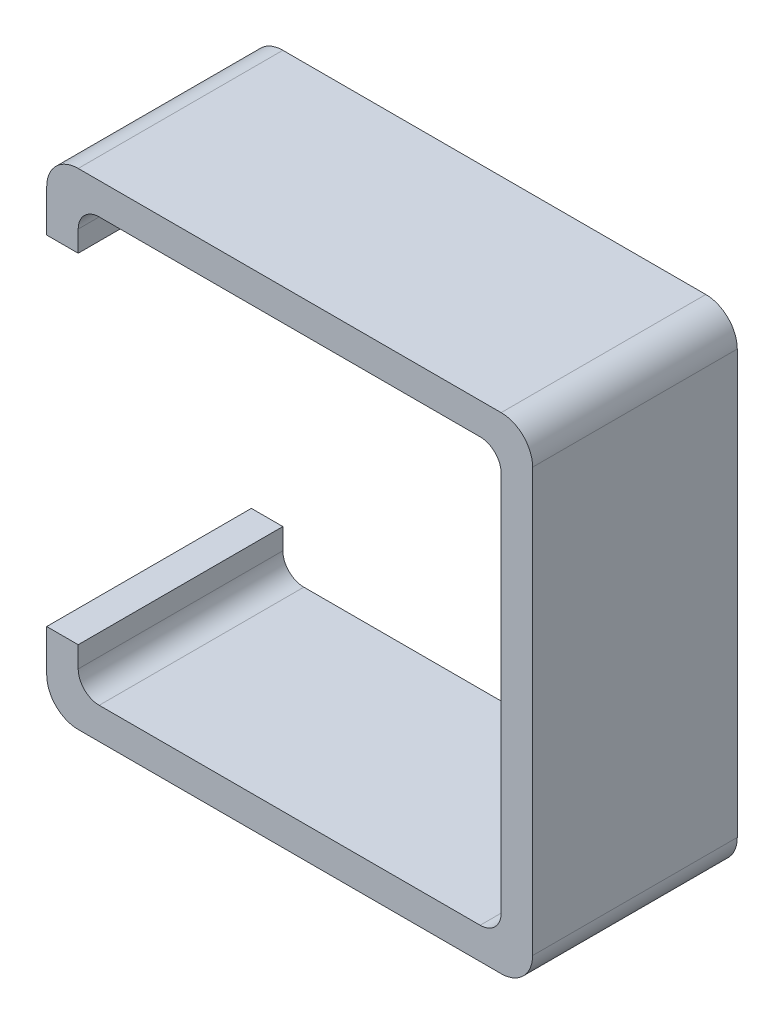
ISO-10303-21;
HEADER;
FILE_DESCRIPTION(('STEP AP214'),'2;1');
FILE_NAME('part.step','',(''),(''),'','','');
FILE_SCHEMA(('AUTOMOTIVE_DESIGN { 1 0 10303 214 1 1 1 1 }'));
ENDSEC;
DATA;
#1=APPLICATION_CONTEXT('core data for automotive mechanical design processes');
#2=APPLICATION_PROTOCOL_DEFINITION('international standard','automotive_design',2000,#1);
#3=PRODUCT_CONTEXT('',#1,'mechanical');
#4=PRODUCT('Part','Part','',(#3));
#5=PRODUCT_RELATED_PRODUCT_CATEGORY('part','',(#4));
#6=PRODUCT_DEFINITION_FORMATION('','',#4);
#7=PRODUCT_DEFINITION_CONTEXT('part definition',#1,'design');
#8=PRODUCT_DEFINITION('design','',#6,#7);
#9=PRODUCT_DEFINITION_SHAPE('','',#8);
#10=(LENGTH_UNIT() NAMED_UNIT(*) SI_UNIT(.MILLI.,.METRE.));
#11=(NAMED_UNIT(*) PLANE_ANGLE_UNIT() SI_UNIT($,.RADIAN.));
#12=(NAMED_UNIT(*) SI_UNIT($,.STERADIAN.) SOLID_ANGLE_UNIT());
#13=UNCERTAINTY_MEASURE_WITH_UNIT(LENGTH_MEASURE(1.E-05),#10,'distance_accuracy_value','');
#14=(GEOMETRIC_REPRESENTATION_CONTEXT(3) GLOBAL_UNCERTAINTY_ASSIGNED_CONTEXT((#13)) GLOBAL_UNIT_ASSIGNED_CONTEXT((#10,
#11,#12)) REPRESENTATION_CONTEXT('',''));
#15=CARTESIAN_POINT('',(0.,0.,0.));
#16=DIRECTION('',(0.,0.,1.));
#17=DIRECTION('',(1.,0.,0.));
#18=AXIS2_PLACEMENT_3D('',#15,#16,#17);
#19=CARTESIAN_POINT('',(-18.15,8.15,19.5));
#20=DIRECTION('',(0.,-1.,0.));
#21=DIRECTION('',(0.,0.,-1.));
#22=AXIS2_PLACEMENT_3D('',#19,#20,#21);
#23=PLANE('',#22);
#24=DIRECTION('',(-1.,0.,0.));
#25=VECTOR('',#24,1.);
#26=CARTESIAN_POINT('',(-18.15,8.15,0.));
#27=LINE('',#26,#25);
#28=CARTESIAN_POINT('',(20.15,8.15,0.));
#29=VERTEX_POINT('',#28);
#30=CARTESIAN_POINT('',(-20.15,8.15,0.));
#31=VERTEX_POINT('',#30);
#32=EDGE_CURVE('E127',#29,#31,#27,.T.);
#33=ORIENTED_EDGE('',*,*,#32,.T.);
#34=DIRECTION('',(0.,0.,-1.));
#35=VECTOR('',#34,1.);
#36=CARTESIAN_POINT('',(-20.15,8.15,19.5));
#37=LINE('',#36,#35);
#38=CARTESIAN_POINT('',(-20.15,8.15,19.5));
#39=VERTEX_POINT('',#38);
#40=EDGE_CURVE('E11',#39,#31,#37,.T.);
#41=ORIENTED_EDGE('',*,*,#40,.F.);
#42=DIRECTION('',(-1.,0.,0.));
#43=VECTOR('',#42,1.);
#44=CARTESIAN_POINT('',(20.15,8.15,19.5));
#45=LINE('',#44,#43);
#46=CARTESIAN_POINT('',(20.15,8.15,19.5));
#47=VERTEX_POINT('',#46);
#48=EDGE_CURVE('E133',#47,#39,#45,.T.);
#49=ORIENTED_EDGE('',*,*,#48,.F.);
#50=DIRECTION('',(0.,0.,-1.));
#51=VECTOR('',#50,1.);
#52=CARTESIAN_POINT('',(20.15,8.15,19.5));
#53=LINE('',#52,#51);
#54=EDGE_CURVE('E203',#47,#29,#53,.T.);
#55=ORIENTED_EDGE('',*,*,#54,.T.);
#56=EDGE_LOOP('',(#33,#41,#49,#55));
#57=FACE_BOUND('',#56,.T.);
#58=ADVANCED_FACE('F39',(#57),#23,.F.);
#59=CARTESIAN_POINT('',(-20.15,5.15,19.5));
#60=DIRECTION('',(0.,0.,-1.));
#61=DIRECTION('',(-1.,0.,0.));
#62=AXIS2_PLACEMENT_3D('',#59,#60,#61);
#63=CYLINDRICAL_SURFACE('',#62,3.);
#64=CARTESIAN_POINT('',(-20.15,5.15,0.));
#65=DIRECTION('',(0.,0.,1.));
#66=DIRECTION('',(1.,0.,0.));
#67=AXIS2_PLACEMENT_3D('',#64,#65,#66);
#68=CIRCLE('',#67,3.);
#69=CARTESIAN_POINT('',(-23.15,5.15,0.));
#70=VERTEX_POINT('',#69);
#71=EDGE_CURVE('E208',#31,#70,#68,.T.);
#72=ORIENTED_EDGE('',*,*,#71,.T.);
#73=DIRECTION('',(0.,0.,-1.));
#74=VECTOR('',#73,1.);
#75=CARTESIAN_POINT('',(-23.15,5.15,19.5));
#76=LINE('',#75,#74);
#77=CARTESIAN_POINT('',(-23.15,5.15,19.5));
#78=VERTEX_POINT('',#77);
#79=EDGE_CURVE('E47',#78,#70,#76,.T.);
#80=ORIENTED_EDGE('',*,*,#79,.F.);
#81=CARTESIAN_POINT('',(-20.15,5.15,19.5));
#82=DIRECTION('',(0.,0.,1.));
#83=DIRECTION('',(1.,0.,0.));
#84=AXIS2_PLACEMENT_3D('',#81,#82,#83);
#85=CIRCLE('',#84,3.);
#86=EDGE_CURVE('E352',#39,#78,#85,.T.);
#87=ORIENTED_EDGE('',*,*,#86,.F.);
#88=ORIENTED_EDGE('',*,*,#40,.T.);
#89=EDGE_LOOP('',(#72,#80,#87,#88));
#90=FACE_BOUND('',#89,.T.);
#91=ADVANCED_FACE('F355',(#90),#63,.T.);
#92=CARTESIAN_POINT('',(-23.15,5.15,19.5));
#93=DIRECTION('',(1.,0.,0.));
#94=DIRECTION('',(0.,0.,-1.));
#95=AXIS2_PLACEMENT_3D('',#92,#93,#94);
#96=PLANE('',#95);
#97=DIRECTION('',(0.,-1.,0.));
#98=VECTOR('',#97,1.);
#99=CARTESIAN_POINT('',(-23.15,5.15,0.));
#100=LINE('',#99,#98);
#101=CARTESIAN_POINT('',(-23.15,1.15,0.));
#102=VERTEX_POINT('',#101);
#103=EDGE_CURVE('E210',#70,#102,#100,.T.);
#104=ORIENTED_EDGE('',*,*,#103,.T.);
#105=DIRECTION('',(0.,0.,-1.));
#106=VECTOR('',#105,1.);
#107=CARTESIAN_POINT('',(-23.15,1.15,19.5));
#108=LINE('',#107,#106);
#109=CARTESIAN_POINT('',(-23.15,1.15,19.5));
#110=VERTEX_POINT('',#109);
#111=EDGE_CURVE('E287',#110,#102,#108,.T.);
#112=ORIENTED_EDGE('',*,*,#111,.F.);
#113=DIRECTION('',(0.,-1.,0.));
#114=VECTOR('',#113,1.);
#115=CARTESIAN_POINT('',(-23.15,5.15,19.5));
#116=LINE('',#115,#114);
#117=EDGE_CURVE('E296',#78,#110,#116,.T.);
#118=ORIENTED_EDGE('',*,*,#117,.F.);
#119=ORIENTED_EDGE('',*,*,#79,.T.);
#120=EDGE_LOOP('',(#104,#112,#118,#119));
#121=FACE_BOUND('',#120,.T.);
#122=ADVANCED_FACE('F294',(#121),#96,.F.);
#123=CARTESIAN_POINT('',(-23.15,1.15,19.5));
#124=DIRECTION('',(0.,1.,0.));
#125=DIRECTION('',(0.,0.,1.));
#126=AXIS2_PLACEMENT_3D('',#123,#124,#125);
#127=PLANE('',#126);
#128=DIRECTION('',(1.,0.,0.));
#129=VECTOR('',#128,1.);
#130=CARTESIAN_POINT('',(-23.15,1.15,0.));
#131=LINE('',#130,#129);
#132=CARTESIAN_POINT('',(-20.15,1.15,0.));
#133=VERTEX_POINT('',#132);
#134=EDGE_CURVE('E212',#102,#133,#131,.T.);
#135=ORIENTED_EDGE('',*,*,#134,.T.);
#136=DIRECTION('',(0.,0.,-1.));
#137=VECTOR('',#136,1.);
#138=CARTESIAN_POINT('',(-20.15,1.15,19.5));
#139=LINE('',#138,#137);
#140=CARTESIAN_POINT('',(-20.15,1.15,19.5));
#141=VERTEX_POINT('',#140);
#142=EDGE_CURVE('E284',#141,#133,#139,.T.);
#143=ORIENTED_EDGE('',*,*,#142,.F.);
#144=DIRECTION('',(1.,0.,0.));
#145=VECTOR('',#144,1.);
#146=CARTESIAN_POINT('',(-23.15,1.15,19.5));
#147=LINE('',#146,#145);
#148=EDGE_CURVE('E314',#110,#141,#147,.T.);
#149=ORIENTED_EDGE('',*,*,#148,.F.);
#150=ORIENTED_EDGE('',*,*,#111,.T.);
#151=EDGE_LOOP('',(#135,#143,#149,#150));
#152=FACE_BOUND('',#151,.T.);
#153=ADVANCED_FACE('F305',(#152),#127,.F.);
#154=CARTESIAN_POINT('',(-20.15,1.15,19.5));
#155=DIRECTION('',(-1.,0.,0.));
#156=DIRECTION('',(0.,0.,1.));
#157=AXIS2_PLACEMENT_3D('',#154,#155,#156);
#158=PLANE('',#157);
#159=DIRECTION('',(0.,1.,0.));
#160=VECTOR('',#159,1.);
#161=CARTESIAN_POINT('',(-20.15,1.15,0.));
#162=LINE('',#161,#160);
#163=CARTESIAN_POINT('',(-20.15,3.15,0.));
#164=VERTEX_POINT('',#163);
#165=EDGE_CURVE('E214',#133,#164,#162,.T.);
#166=ORIENTED_EDGE('',*,*,#165,.T.);
#167=DIRECTION('',(0.,0.,-1.));
#168=VECTOR('',#167,1.);
#169=CARTESIAN_POINT('',(-20.15,3.15,19.5));
#170=LINE('',#169,#168);
#171=CARTESIAN_POINT('',(-20.15,3.15,19.5));
#172=VERTEX_POINT('',#171);
#173=EDGE_CURVE('E281',#172,#164,#170,.T.);
#174=ORIENTED_EDGE('',*,*,#173,.F.);
#175=DIRECTION('',(0.,1.,0.));
#176=VECTOR('',#175,1.);
#177=CARTESIAN_POINT('',(-20.15,1.15,19.5));
#178=LINE('',#177,#176);
#179=EDGE_CURVE('E311',#141,#172,#178,.T.);
#180=ORIENTED_EDGE('',*,*,#179,.F.);
#181=ORIENTED_EDGE('',*,*,#142,.T.);
#182=EDGE_LOOP('',(#166,#174,#180,#181));
#183=FACE_BOUND('',#182,.T.);
#184=ADVANCED_FACE('F309',(#183),#158,.F.);
#185=CARTESIAN_POINT('',(-18.15,3.15,19.5));
#186=DIRECTION('',(0.,0.,-1.));
#187=DIRECTION('',(-1.,0.,0.));
#188=AXIS2_PLACEMENT_3D('',#185,#186,#187);
#189=CYLINDRICAL_SURFACE('',#188,2.);
#190=CARTESIAN_POINT('',(-18.15,3.15,0.));
#191=DIRECTION('',(0.,0.,-1.));
#192=DIRECTION('',(1.,0.,0.));
#193=AXIS2_PLACEMENT_3D('',#190,#191,#192);
#194=CIRCLE('',#193,2.);
#195=CARTESIAN_POINT('',(-18.15,5.15,0.));
#196=VERTEX_POINT('',#195);
#197=EDGE_CURVE('E216',#164,#196,#194,.T.);
#198=ORIENTED_EDGE('',*,*,#197,.T.);
#199=DIRECTION('',(0.,0.,-1.));
#200=VECTOR('',#199,1.);
#201=CARTESIAN_POINT('',(-18.15,5.15,19.5));
#202=LINE('',#201,#200);
#203=CARTESIAN_POINT('',(-18.15,5.15,19.5));
#204=VERTEX_POINT('',#203);
#205=EDGE_CURVE('E278',#204,#196,#202,.T.);
#206=ORIENTED_EDGE('',*,*,#205,.F.);
#207=CARTESIAN_POINT('',(-18.15,3.15,19.5));
#208=DIRECTION('',(0.,0.,-1.));
#209=DIRECTION('',(1.,0.,0.));
#210=AXIS2_PLACEMENT_3D('',#207,#208,#209);
#211=CIRCLE('',#210,2.);
#212=EDGE_CURVE('E313',#172,#204,#211,.T.);
#213=ORIENTED_EDGE('',*,*,#212,.F.);
#214=ORIENTED_EDGE('',*,*,#173,.T.);
#215=EDGE_LOOP('',(#198,#206,#213,#214));
#216=FACE_BOUND('',#215,.T.);
#217=ADVANCED_FACE('F367',(#216),#189,.F.);
#218=CARTESIAN_POINT('',(-18.15,5.15,19.5));
#219=DIRECTION('',(0.,1.,0.));
#220=DIRECTION('',(0.,0.,1.));
#221=AXIS2_PLACEMENT_3D('',#218,#219,#220);
#222=PLANE('',#221);
#223=DIRECTION('',(1.,0.,0.));
#224=VECTOR('',#223,1.);
#225=CARTESIAN_POINT('',(-18.15,5.15,0.));
#226=LINE('',#225,#224);
#227=CARTESIAN_POINT('',(18.15,5.15,0.));
#228=VERTEX_POINT('',#227);
#229=EDGE_CURVE('E218',#196,#228,#226,.T.);
#230=ORIENTED_EDGE('',*,*,#229,.T.);
#231=DIRECTION('',(0.,0.,-1.));
#232=VECTOR('',#231,1.);
#233=CARTESIAN_POINT('',(18.15,5.15,19.5));
#234=LINE('',#233,#232);
#235=CARTESIAN_POINT('',(18.15,5.15,19.5));
#236=VERTEX_POINT('',#235);
#237=EDGE_CURVE('E275',#236,#228,#234,.T.);
#238=ORIENTED_EDGE('',*,*,#237,.F.);
#239=DIRECTION('',(1.,0.,0.));
#240=VECTOR('',#239,1.);
#241=CARTESIAN_POINT('',(-18.15,5.15,19.5));
#242=LINE('',#241,#240);
#243=EDGE_CURVE('E316',#204,#236,#242,.T.);
#244=ORIENTED_EDGE('',*,*,#243,.F.);
#245=ORIENTED_EDGE('',*,*,#205,.T.);
#246=EDGE_LOOP('',(#230,#238,#244,#245));
#247=FACE_BOUND('',#246,.T.);
#248=ADVANCED_FACE('F370',(#247),#222,.F.);
#249=CARTESIAN_POINT('',(18.15,3.15,19.5));
#250=DIRECTION('',(0.,0.,-1.));
#251=DIRECTION('',(-1.,0.,0.));
#252=AXIS2_PLACEMENT_3D('',#249,#250,#251);
#253=CYLINDRICAL_SURFACE('',#252,2.);
#254=CARTESIAN_POINT('',(18.15,3.15,0.));
#255=DIRECTION('',(0.,0.,-1.));
#256=DIRECTION('',(1.,0.,0.));
#257=AXIS2_PLACEMENT_3D('',#254,#255,#256);
#258=CIRCLE('',#257,2.);
#259=CARTESIAN_POINT('',(20.15,3.15,0.));
#260=VERTEX_POINT('',#259);
#261=EDGE_CURVE('E220',#228,#260,#258,.T.);
#262=ORIENTED_EDGE('',*,*,#261,.T.);
#263=DIRECTION('',(0.,0.,-1.));
#264=VECTOR('',#263,1.);
#265=CARTESIAN_POINT('',(20.15,3.15,19.5));
#266=LINE('',#265,#264);
#267=CARTESIAN_POINT('',(20.15,3.15,19.5));
#268=VERTEX_POINT('',#267);
#269=EDGE_CURVE('E272',#268,#260,#266,.T.);
#270=ORIENTED_EDGE('',*,*,#269,.F.);
#271=CARTESIAN_POINT('',(18.15,3.15,19.5));
#272=DIRECTION('',(0.,0.,-1.));
#273=DIRECTION('',(1.,0.,0.));
#274=AXIS2_PLACEMENT_3D('',#271,#272,#273);
#275=CIRCLE('',#274,2.);
#276=EDGE_CURVE('E322',#236,#268,#275,.T.);
#277=ORIENTED_EDGE('',*,*,#276,.F.);
#278=ORIENTED_EDGE('',*,*,#237,.T.);
#279=EDGE_LOOP('',(#262,#270,#277,#278));
#280=FACE_BOUND('',#279,.T.);
#281=ADVANCED_FACE('F374',(#280),#253,.F.);
#282=CARTESIAN_POINT('',(20.15,3.15,19.5));
#283=DIRECTION('',(1.,0.,0.));
#284=DIRECTION('',(0.,0.,-1.));
#285=AXIS2_PLACEMENT_3D('',#282,#283,#284);
#286=PLANE('',#285);
#287=DIRECTION('',(0.,-1.,0.));
#288=VECTOR('',#287,1.);
#289=CARTESIAN_POINT('',(20.15,3.15,0.));
#290=LINE('',#289,#288);
#291=CARTESIAN_POINT('',(20.15,-33.15,0.));
#292=VERTEX_POINT('',#291);
#293=EDGE_CURVE('E222',#260,#292,#290,.T.);
#294=ORIENTED_EDGE('',*,*,#293,.T.);
#295=DIRECTION('',(0.,0.,-1.));
#296=VECTOR('',#295,1.);
#297=CARTESIAN_POINT('',(20.15,-33.15,19.5));
#298=LINE('',#297,#296);
#299=CARTESIAN_POINT('',(20.15,-33.15,19.5));
#300=VERTEX_POINT('',#299);
#301=EDGE_CURVE('E269',#300,#292,#298,.T.);
#302=ORIENTED_EDGE('',*,*,#301,.F.);
#303=DIRECTION('',(0.,-1.,0.));
#304=VECTOR('',#303,1.);
#305=CARTESIAN_POINT('',(20.15,3.15,19.5));
#306=LINE('',#305,#304);
#307=EDGE_CURVE('E324',#268,#300,#306,.T.);
#308=ORIENTED_EDGE('',*,*,#307,.F.);
#309=ORIENTED_EDGE('',*,*,#269,.T.);
#310=EDGE_LOOP('',(#294,#302,#308,#309));
#311=FACE_BOUND('',#310,.T.);
#312=ADVANCED_FACE('F378',(#311),#286,.F.);
#313=CARTESIAN_POINT('',(18.15,-33.15,19.5));
#314=DIRECTION('',(0.,0.,-1.));
#315=DIRECTION('',(-1.,0.,0.));
#316=AXIS2_PLACEMENT_3D('',#313,#314,#315);
#317=CYLINDRICAL_SURFACE('',#316,2.);
#318=CARTESIAN_POINT('',(18.15,-33.15,0.));
#319=DIRECTION('',(0.,0.,-1.));
#320=DIRECTION('',(1.,0.,0.));
#321=AXIS2_PLACEMENT_3D('',#318,#319,#320);
#322=CIRCLE('',#321,2.);
#323=CARTESIAN_POINT('',(18.15,-35.15,0.));
#324=VERTEX_POINT('',#323);
#325=EDGE_CURVE('E224',#292,#324,#322,.T.);
#326=ORIENTED_EDGE('',*,*,#325,.T.);
#327=DIRECTION('',(0.,0.,-1.));
#328=VECTOR('',#327,1.);
#329=CARTESIAN_POINT('',(18.15,-35.15,19.5));
#330=LINE('',#329,#328);
#331=CARTESIAN_POINT('',(18.15,-35.15,19.5));
#332=VERTEX_POINT('',#331);
#333=EDGE_CURVE('E266',#332,#324,#330,.T.);
#334=ORIENTED_EDGE('',*,*,#333,.F.);
#335=CARTESIAN_POINT('',(18.15,-33.15,19.5));
#336=DIRECTION('',(0.,0.,-1.));
#337=DIRECTION('',(1.,0.,0.));
#338=AXIS2_PLACEMENT_3D('',#335,#336,#337);
#339=CIRCLE('',#338,2.);
#340=EDGE_CURVE('E326',#300,#332,#339,.T.);
#341=ORIENTED_EDGE('',*,*,#340,.F.);
#342=ORIENTED_EDGE('',*,*,#301,.T.);
#343=EDGE_LOOP('',(#326,#334,#341,#342));
#344=FACE_BOUND('',#343,.T.);
#345=ADVANCED_FACE('F382',(#344),#317,.F.);
#346=CARTESIAN_POINT('',(18.15,-35.15,19.5));
#347=DIRECTION('',(0.,-1.,0.));
#348=DIRECTION('',(0.,0.,-1.));
#349=AXIS2_PLACEMENT_3D('',#346,#347,#348);
#350=PLANE('',#349);
#351=DIRECTION('',(-1.,0.,0.));
#352=VECTOR('',#351,1.);
#353=CARTESIAN_POINT('',(18.15,-35.15,0.));
#354=LINE('',#353,#352);
#355=CARTESIAN_POINT('',(-18.15,-35.15,0.));
#356=VERTEX_POINT('',#355);
#357=EDGE_CURVE('E226',#324,#356,#354,.T.);
#358=ORIENTED_EDGE('',*,*,#357,.T.);
#359=DIRECTION('',(0.,0.,-1.));
#360=VECTOR('',#359,1.);
#361=CARTESIAN_POINT('',(-18.15,-35.15,19.5));
#362=LINE('',#361,#360);
#363=CARTESIAN_POINT('',(-18.15,-35.15,19.5));
#364=VERTEX_POINT('',#363);
#365=EDGE_CURVE('E263',#364,#356,#362,.T.);
#366=ORIENTED_EDGE('',*,*,#365,.F.);
#367=DIRECTION('',(-1.,0.,0.));
#368=VECTOR('',#367,1.);
#369=CARTESIAN_POINT('',(18.15,-35.15,19.5));
#370=LINE('',#369,#368);
#371=EDGE_CURVE('E328',#332,#364,#370,.T.);
#372=ORIENTED_EDGE('',*,*,#371,.F.);
#373=ORIENTED_EDGE('',*,*,#333,.T.);
#374=EDGE_LOOP('',(#358,#366,#372,#373));
#375=FACE_BOUND('',#374,.T.);
#376=ADVANCED_FACE('F386',(#375),#350,.F.);
#377=CARTESIAN_POINT('',(-18.15,-33.15,19.5));
#378=DIRECTION('',(0.,0.,-1.));
#379=DIRECTION('',(-1.,0.,0.));
#380=AXIS2_PLACEMENT_3D('',#377,#378,#379);
#381=CYLINDRICAL_SURFACE('',#380,2.);
#382=CARTESIAN_POINT('',(-18.15,-33.15,0.));
#383=DIRECTION('',(0.,0.,-1.));
#384=DIRECTION('',(1.,0.,0.));
#385=AXIS2_PLACEMENT_3D('',#382,#383,#384);
#386=CIRCLE('',#385,2.);
#387=CARTESIAN_POINT('',(-20.15,-33.15,0.));
#388=VERTEX_POINT('',#387);
#389=EDGE_CURVE('E228',#356,#388,#386,.T.);
#390=ORIENTED_EDGE('',*,*,#389,.T.);
#391=DIRECTION('',(0.,0.,-1.));
#392=VECTOR('',#391,1.);
#393=CARTESIAN_POINT('',(-20.15,-33.15,19.5));
#394=LINE('',#393,#392);
#395=CARTESIAN_POINT('',(-20.15,-33.15,19.5));
#396=VERTEX_POINT('',#395);
#397=EDGE_CURVE('E260',#396,#388,#394,.T.);
#398=ORIENTED_EDGE('',*,*,#397,.F.);
#399=CARTESIAN_POINT('',(-18.15,-33.15,19.5));
#400=DIRECTION('',(0.,0.,-1.));
#401=DIRECTION('',(1.,0.,0.));
#402=AXIS2_PLACEMENT_3D('',#399,#400,#401);
#403=CIRCLE('',#402,2.);
#404=EDGE_CURVE('E330',#364,#396,#403,.T.);
#405=ORIENTED_EDGE('',*,*,#404,.F.);
#406=ORIENTED_EDGE('',*,*,#365,.T.);
#407=EDGE_LOOP('',(#390,#398,#405,#406));
#408=FACE_BOUND('',#407,.T.);
#409=ADVANCED_FACE('F390',(#408),#381,.F.);
#410=CARTESIAN_POINT('',(-20.15,-33.15,19.5));
#411=DIRECTION('',(-1.,0.,0.));
#412=DIRECTION('',(0.,0.,1.));
#413=AXIS2_PLACEMENT_3D('',#410,#411,#412);
#414=PLANE('',#413);
#415=DIRECTION('',(0.,1.,0.));
#416=VECTOR('',#415,1.);
#417=CARTESIAN_POINT('',(-20.15,-33.15,0.));
#418=LINE('',#417,#416);
#419=CARTESIAN_POINT('',(-20.15,-31.15,0.));
#420=VERTEX_POINT('',#419);
#421=EDGE_CURVE('E230',#388,#420,#418,.T.);
#422=ORIENTED_EDGE('',*,*,#421,.T.);
#423=DIRECTION('',(0.,0.,-1.));
#424=VECTOR('',#423,1.);
#425=CARTESIAN_POINT('',(-20.15,-31.15,19.5));
#426=LINE('',#425,#424);
#427=CARTESIAN_POINT('',(-20.15,-31.15,19.5));
#428=VERTEX_POINT('',#427);
#429=EDGE_CURVE('E257',#428,#420,#426,.T.);
#430=ORIENTED_EDGE('',*,*,#429,.F.);
#431=DIRECTION('',(0.,1.,0.));
#432=VECTOR('',#431,1.);
#433=CARTESIAN_POINT('',(-20.15,-33.15,19.5));
#434=LINE('',#433,#432);
#435=EDGE_CURVE('E332',#396,#428,#434,.T.);
#436=ORIENTED_EDGE('',*,*,#435,.F.);
#437=ORIENTED_EDGE('',*,*,#397,.T.);
#438=EDGE_LOOP('',(#422,#430,#436,#437));
#439=FACE_BOUND('',#438,.T.);
#440=ADVANCED_FACE('F394',(#439),#414,.F.);
#441=CARTESIAN_POINT('',(-20.15,-31.15,19.5));
#442=DIRECTION('',(0.,-1.,0.));
#443=DIRECTION('',(0.,0.,-1.));
#444=AXIS2_PLACEMENT_3D('',#441,#442,#443);
#445=PLANE('',#444);
#446=DIRECTION('',(-1.,0.,0.));
#447=VECTOR('',#446,1.);
#448=CARTESIAN_POINT('',(-20.15,-31.15,0.));
#449=LINE('',#448,#447);
#450=CARTESIAN_POINT('',(-23.15,-31.15,0.));
#451=VERTEX_POINT('',#450);
#452=EDGE_CURVE('E232',#420,#451,#449,.T.);
#453=ORIENTED_EDGE('',*,*,#452,.T.);
#454=DIRECTION('',(0.,0.,-1.));
#455=VECTOR('',#454,1.);
#456=CARTESIAN_POINT('',(-23.15,-31.15,19.5));
#457=LINE('',#456,#455);
#458=CARTESIAN_POINT('',(-23.15,-31.15,19.5));
#459=VERTEX_POINT('',#458);
#460=EDGE_CURVE('E254',#459,#451,#457,.T.);
#461=ORIENTED_EDGE('',*,*,#460,.F.);
#462=DIRECTION('',(-1.,0.,0.));
#463=VECTOR('',#462,1.);
#464=CARTESIAN_POINT('',(-20.15,-31.15,19.5));
#465=LINE('',#464,#463);
#466=EDGE_CURVE('E334',#428,#459,#465,.T.);
#467=ORIENTED_EDGE('',*,*,#466,.F.);
#468=ORIENTED_EDGE('',*,*,#429,.T.);
#469=EDGE_LOOP('',(#453,#461,#467,#468));
#470=FACE_BOUND('',#469,.T.);
#471=ADVANCED_FACE('F398',(#470),#445,.F.);
#472=CARTESIAN_POINT('',(-23.15,-31.15,19.5));
#473=DIRECTION('',(1.,0.,0.));
#474=DIRECTION('',(0.,0.,-1.));
#475=AXIS2_PLACEMENT_3D('',#472,#473,#474);
#476=PLANE('',#475);
#477=DIRECTION('',(0.,-1.,0.));
#478=VECTOR('',#477,1.);
#479=CARTESIAN_POINT('',(-23.15,-31.15,0.));
#480=LINE('',#479,#478);
#481=CARTESIAN_POINT('',(-23.15,-35.15,0.));
#482=VERTEX_POINT('',#481);
#483=EDGE_CURVE('E234',#451,#482,#480,.T.);
#484=ORIENTED_EDGE('',*,*,#483,.T.);
#485=DIRECTION('',(0.,0.,-1.));
#486=VECTOR('',#485,1.);
#487=CARTESIAN_POINT('',(-23.15,-35.15,19.5));
#488=LINE('',#487,#486);
#489=CARTESIAN_POINT('',(-23.15,-35.15,19.5));
#490=VERTEX_POINT('',#489);
#491=EDGE_CURVE('E251',#490,#482,#488,.T.);
#492=ORIENTED_EDGE('',*,*,#491,.F.);
#493=DIRECTION('',(0.,-1.,0.));
#494=VECTOR('',#493,1.);
#495=CARTESIAN_POINT('',(-23.15,-31.15,19.5));
#496=LINE('',#495,#494);
#497=EDGE_CURVE('E336',#459,#490,#496,.T.);
#498=ORIENTED_EDGE('',*,*,#497,.F.);
#499=ORIENTED_EDGE('',*,*,#460,.T.);
#500=EDGE_LOOP('',(#484,#492,#498,#499));
#501=FACE_BOUND('',#500,.T.);
#502=ADVANCED_FACE('F402',(#501),#476,.F.);
#503=CARTESIAN_POINT('',(-20.15,-35.15,19.5));
#504=DIRECTION('',(0.,0.,-1.));
#505=DIRECTION('',(-1.,0.,0.));
#506=AXIS2_PLACEMENT_3D('',#503,#504,#505);
#507=CYLINDRICAL_SURFACE('',#506,3.);
#508=CARTESIAN_POINT('',(-20.15,-35.15,0.));
#509=DIRECTION('',(0.,0.,1.));
#510=DIRECTION('',(1.,0.,0.));
#511=AXIS2_PLACEMENT_3D('',#508,#509,#510);
#512=CIRCLE('',#511,3.);
#513=CARTESIAN_POINT('',(-20.15,-38.15,0.));
#514=VERTEX_POINT('',#513);
#515=EDGE_CURVE('E236',#482,#514,#512,.T.);
#516=ORIENTED_EDGE('',*,*,#515,.T.);
#517=DIRECTION('',(0.,0.,-1.));
#518=VECTOR('',#517,1.);
#519=CARTESIAN_POINT('',(-20.15,-38.15,19.5));
#520=LINE('',#519,#518);
#521=CARTESIAN_POINT('',(-20.15,-38.15,19.5));
#522=VERTEX_POINT('',#521);
#523=EDGE_CURVE('E248',#522,#514,#520,.T.);
#524=ORIENTED_EDGE('',*,*,#523,.F.);
#525=CARTESIAN_POINT('',(-20.15,-35.15,19.5));
#526=DIRECTION('',(0.,0.,1.));
#527=DIRECTION('',(1.,0.,0.));
#528=AXIS2_PLACEMENT_3D('',#525,#526,#527);
#529=CIRCLE('',#528,3.);
#530=EDGE_CURVE('E338',#490,#522,#529,.T.);
#531=ORIENTED_EDGE('',*,*,#530,.F.);
#532=ORIENTED_EDGE('',*,*,#491,.T.);
#533=EDGE_LOOP('',(#516,#524,#531,#532));
#534=FACE_BOUND('',#533,.T.);
#535=ADVANCED_FACE('F344',(#534),#507,.T.);
#536=CARTESIAN_POINT('',(-20.15,-38.15,19.5));
#537=DIRECTION('',(0.,1.,0.));
#538=DIRECTION('',(0.,0.,1.));
#539=AXIS2_PLACEMENT_3D('',#536,#537,#538);
#540=PLANE('',#539);
#541=DIRECTION('',(1.,0.,0.));
#542=VECTOR('',#541,1.);
#543=CARTESIAN_POINT('',(-20.15,-38.15,0.));
#544=LINE('',#543,#542);
#545=CARTESIAN_POINT('',(20.15,-38.15,0.));
#546=VERTEX_POINT('',#545);
#547=EDGE_CURVE('E238',#514,#546,#544,.T.);
#548=ORIENTED_EDGE('',*,*,#547,.T.);
#549=DIRECTION('',(0.,0.,-1.));
#550=VECTOR('',#549,1.);
#551=CARTESIAN_POINT('',(20.15,-38.15,19.5));
#552=LINE('',#551,#550);
#553=CARTESIAN_POINT('',(20.15,-38.15,19.5));
#554=VERTEX_POINT('',#553);
#555=EDGE_CURVE('E198',#554,#546,#552,.T.);
#556=ORIENTED_EDGE('',*,*,#555,.F.);
#557=DIRECTION('',(1.,0.,0.));
#558=VECTOR('',#557,1.);
#559=CARTESIAN_POINT('',(-20.15,-38.15,19.5));
#560=LINE('',#559,#558);
#561=EDGE_CURVE('E189',#522,#554,#560,.T.);
#562=ORIENTED_EDGE('',*,*,#561,.F.);
#563=ORIENTED_EDGE('',*,*,#523,.T.);
#564=EDGE_LOOP('',(#548,#556,#562,#563));
#565=FACE_BOUND('',#564,.T.);
#566=ADVANCED_FACE('F348',(#565),#540,.F.);
#567=CARTESIAN_POINT('',(20.15,-35.15,19.5));
#568=DIRECTION('',(0.,0.,-1.));
#569=DIRECTION('',(-1.,0.,0.));
#570=AXIS2_PLACEMENT_3D('',#567,#568,#569);
#571=CYLINDRICAL_SURFACE('',#570,3.);
#572=CARTESIAN_POINT('',(20.15,-35.15,0.));
#573=DIRECTION('',(0.,0.,1.));
#574=DIRECTION('',(1.,0.,0.));
#575=AXIS2_PLACEMENT_3D('',#572,#573,#574);
#576=CIRCLE('',#575,3.);
#577=CARTESIAN_POINT('',(23.15,-35.15,0.));
#578=VERTEX_POINT('',#577);
#579=EDGE_CURVE('E197',#546,#578,#576,.T.);
#580=ORIENTED_EDGE('',*,*,#579,.T.);
#581=DIRECTION('',(0.,0.,-1.));
#582=VECTOR('',#581,1.);
#583=CARTESIAN_POINT('',(23.15,-35.15,19.5));
#584=LINE('',#583,#582);
#585=CARTESIAN_POINT('',(23.15,-35.15,19.5));
#586=VERTEX_POINT('',#585);
#587=EDGE_CURVE('E194',#586,#578,#584,.T.);
#588=ORIENTED_EDGE('',*,*,#587,.F.);
#589=CARTESIAN_POINT('',(20.15,-35.15,19.5));
#590=DIRECTION('',(0.,0.,1.));
#591=DIRECTION('',(1.,0.,0.));
#592=AXIS2_PLACEMENT_3D('',#589,#590,#591);
#593=CIRCLE('',#592,3.);
#594=EDGE_CURVE('E183',#554,#586,#593,.T.);
#595=ORIENTED_EDGE('',*,*,#594,.F.);
#596=ORIENTED_EDGE('',*,*,#555,.T.);
#597=EDGE_LOOP('',(#580,#588,#595,#596));
#598=FACE_BOUND('',#597,.T.);
#599=ADVANCED_FACE('F195',(#598),#571,.T.);
#600=CARTESIAN_POINT('',(23.15,-35.15,19.5));
#601=DIRECTION('',(-1.,0.,0.));
#602=DIRECTION('',(0.,0.,1.));
#603=AXIS2_PLACEMENT_3D('',#600,#601,#602);
#604=PLANE('',#603);
#605=DIRECTION('',(0.,1.,0.));
#606=VECTOR('',#605,1.);
#607=CARTESIAN_POINT('',(23.15,-35.15,0.));
#608=LINE('',#607,#606);
#609=CARTESIAN_POINT('',(23.15,5.15,0.));
#610=VERTEX_POINT('',#609);
#611=EDGE_CURVE('E120',#578,#610,#608,.T.);
#612=ORIENTED_EDGE('',*,*,#611,.T.);
#613=DIRECTION('',(0.,0.,-1.));
#614=VECTOR('',#613,1.);
#615=CARTESIAN_POINT('',(23.15,5.15,19.5));
#616=LINE('',#615,#614);
#617=CARTESIAN_POINT('',(23.15,5.15,19.5));
#618=VERTEX_POINT('',#617);
#619=EDGE_CURVE('E199',#618,#610,#616,.T.);
#620=ORIENTED_EDGE('',*,*,#619,.F.);
#621=DIRECTION('',(0.,1.,0.));
#622=VECTOR('',#621,1.);
#623=CARTESIAN_POINT('',(23.15,-35.15,19.5));
#624=LINE('',#623,#622);
#625=EDGE_CURVE('E187',#586,#618,#624,.T.);
#626=ORIENTED_EDGE('',*,*,#625,.F.);
#627=ORIENTED_EDGE('',*,*,#587,.T.);
#628=EDGE_LOOP('',(#612,#620,#626,#627));
#629=FACE_BOUND('',#628,.T.);
#630=ADVANCED_FACE('F201',(#629),#604,.F.);
#631=CARTESIAN_POINT('',(20.15,5.15,19.5));
#632=DIRECTION('',(0.,0.,-1.));
#633=DIRECTION('',(-1.,0.,0.));
#634=AXIS2_PLACEMENT_3D('',#631,#632,#633);
#635=CYLINDRICAL_SURFACE('',#634,3.);
#636=CARTESIAN_POINT('',(20.15,5.15,0.));
#637=DIRECTION('',(0.,0.,1.));
#638=DIRECTION('',(1.,0.,0.));
#639=AXIS2_PLACEMENT_3D('',#636,#637,#638);
#640=CIRCLE('',#639,3.);
#641=EDGE_CURVE('E242',#610,#29,#640,.T.);
#642=ORIENTED_EDGE('',*,*,#641,.T.);
#643=ORIENTED_EDGE('',*,*,#54,.F.);
#644=CARTESIAN_POINT('',(20.15,5.15,19.5));
#645=DIRECTION('',(0.,0.,1.));
#646=DIRECTION('',(1.,0.,0.));
#647=AXIS2_PLACEMENT_3D('',#644,#645,#646);
#648=CIRCLE('',#647,3.);
#649=EDGE_CURVE('E55',#618,#47,#648,.T.);
#650=ORIENTED_EDGE('',*,*,#649,.F.);
#651=ORIENTED_EDGE('',*,*,#619,.T.);
#652=EDGE_LOOP('',(#642,#643,#650,#651));
#653=FACE_BOUND('',#652,.T.);
#654=ADVANCED_FACE('F350',(#653),#635,.T.);
#655=CARTESIAN_POINT('',(-20.15,5.15,19.5));
#656=DIRECTION('',(0.,0.,1.));
#657=DIRECTION('',(1.,0.,0.));
#658=AXIS2_PLACEMENT_3D('',#655,#656,#657);
#659=PLANE('',#658);
#660=ORIENTED_EDGE('',*,*,#48,.T.);
#661=ORIENTED_EDGE('',*,*,#86,.T.);
#662=ORIENTED_EDGE('',*,*,#117,.T.);
#663=ORIENTED_EDGE('',*,*,#148,.T.);
#664=ORIENTED_EDGE('',*,*,#179,.T.);
#665=ORIENTED_EDGE('',*,*,#212,.T.);
#666=ORIENTED_EDGE('',*,*,#243,.T.);
#667=ORIENTED_EDGE('',*,*,#276,.T.);
#668=ORIENTED_EDGE('',*,*,#307,.T.);
#669=ORIENTED_EDGE('',*,*,#340,.T.);
#670=ORIENTED_EDGE('',*,*,#371,.T.);
#671=ORIENTED_EDGE('',*,*,#404,.T.);
#672=ORIENTED_EDGE('',*,*,#435,.T.);
#673=ORIENTED_EDGE('',*,*,#466,.T.);
#674=ORIENTED_EDGE('',*,*,#497,.T.);
#675=ORIENTED_EDGE('',*,*,#530,.T.);
#676=ORIENTED_EDGE('',*,*,#561,.T.);
#677=ORIENTED_EDGE('',*,*,#594,.T.);
#678=ORIENTED_EDGE('',*,*,#625,.T.);
#679=ORIENTED_EDGE('',*,*,#649,.T.);
#680=EDGE_LOOP('',(#660,#661,#662,#663,#664,#665,#666,#667,#668,#669,#670,#671,#672,#673,#674,
#675,#676,#677,#678,#679));
#681=FACE_BOUND('',#680,.T.);
#682=ADVANCED_FACE('F185',(#681),#659,.T.);
#683=CARTESIAN_POINT('',(-20.15,5.15,0.));
#684=DIRECTION('',(0.,0.,1.));
#685=DIRECTION('',(1.,0.,0.));
#686=AXIS2_PLACEMENT_3D('',#683,#684,#685);
#687=PLANE('',#686);
#688=ORIENTED_EDGE('',*,*,#32,.F.);
#689=ORIENTED_EDGE('',*,*,#641,.F.);
#690=ORIENTED_EDGE('',*,*,#611,.F.);
#691=ORIENTED_EDGE('',*,*,#579,.F.);
#692=ORIENTED_EDGE('',*,*,#547,.F.);
#693=ORIENTED_EDGE('',*,*,#515,.F.);
#694=ORIENTED_EDGE('',*,*,#483,.F.);
#695=ORIENTED_EDGE('',*,*,#452,.F.);
#696=ORIENTED_EDGE('',*,*,#421,.F.);
#697=ORIENTED_EDGE('',*,*,#389,.F.);
#698=ORIENTED_EDGE('',*,*,#357,.F.);
#699=ORIENTED_EDGE('',*,*,#325,.F.);
#700=ORIENTED_EDGE('',*,*,#293,.F.);
#701=ORIENTED_EDGE('',*,*,#261,.F.);
#702=ORIENTED_EDGE('',*,*,#229,.F.);
#703=ORIENTED_EDGE('',*,*,#197,.F.);
#704=ORIENTED_EDGE('',*,*,#165,.F.);
#705=ORIENTED_EDGE('',*,*,#134,.F.);
#706=ORIENTED_EDGE('',*,*,#103,.F.);
#707=ORIENTED_EDGE('',*,*,#71,.F.);
#708=EDGE_LOOP('',(#688,#689,#690,#691,#692,#693,#694,#695,#696,#697,#698,#699,#700,#701,#702,
#703,#704,#705,#706,#707));
#709=FACE_BOUND('',#708,.T.);
#710=ADVANCED_FACE('F300',(#709),#687,.F.);
#711=CLOSED_SHELL('',(#58,#91,#122,#153,#184,#217,#248,#281,#312,#345,#376,#409,#440,#471,#502,
#535,#566,#599,#630,#654,#682,#710));
#712=MANIFOLD_SOLID_BREP('B2',#711);
#713=ADVANCED_BREP_SHAPE_REPRESENTATION('',(#18,#712),#14);
#714=SHAPE_DEFINITION_REPRESENTATION(#9,#713);
ENDSEC;
END-ISO-10303-21;
